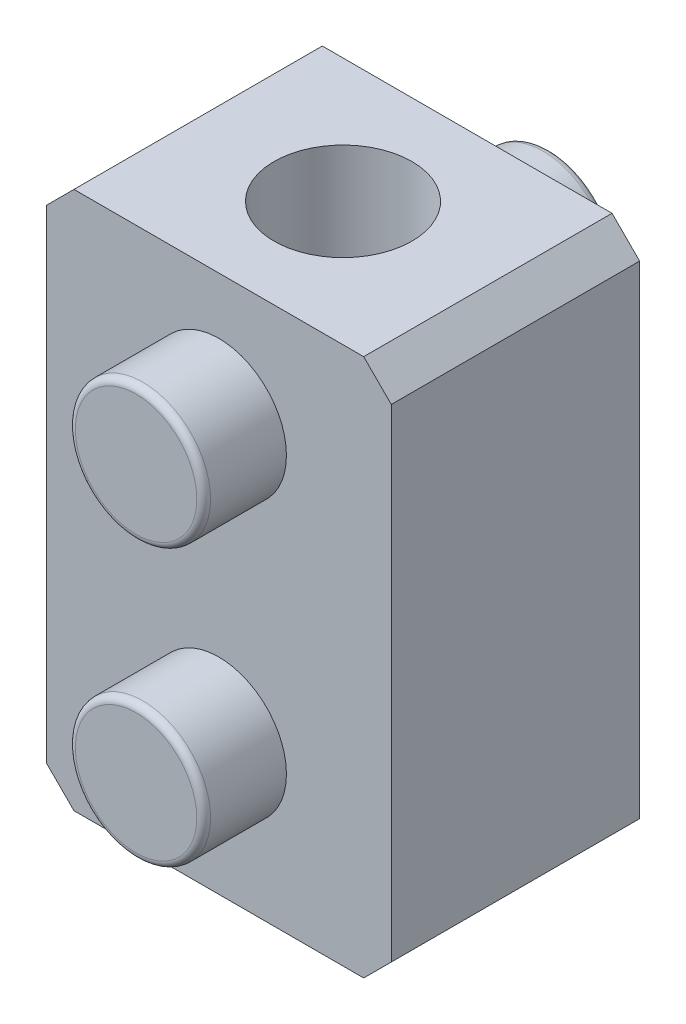
ISO-10303-21;
HEADER;
FILE_DESCRIPTION(('STEP AP214'),'2;1');
FILE_NAME('part.step','',(''),(''),'','','');
FILE_SCHEMA(('AUTOMOTIVE_DESIGN { 1 0 10303 214 1 1 1 1 }'));
ENDSEC;
DATA;
#1=APPLICATION_CONTEXT('core data for automotive mechanical design processes');
#2=APPLICATION_PROTOCOL_DEFINITION('international standard','automotive_design',2000,#1);
#3=PRODUCT_CONTEXT('',#1,'mechanical');
#4=PRODUCT('Part','Part','',(#3));
#5=PRODUCT_RELATED_PRODUCT_CATEGORY('part','',(#4));
#6=PRODUCT_DEFINITION_FORMATION('','',#4);
#7=PRODUCT_DEFINITION_CONTEXT('part definition',#1,'design');
#8=PRODUCT_DEFINITION('design','',#6,#7);
#9=PRODUCT_DEFINITION_SHAPE('','',#8);
#10=(LENGTH_UNIT() NAMED_UNIT(*) SI_UNIT(.MILLI.,.METRE.));
#11=(NAMED_UNIT(*) PLANE_ANGLE_UNIT() SI_UNIT($,.RADIAN.));
#12=(NAMED_UNIT(*) SI_UNIT($,.STERADIAN.) SOLID_ANGLE_UNIT());
#13=UNCERTAINTY_MEASURE_WITH_UNIT(LENGTH_MEASURE(1.E-05),#10,'distance_accuracy_value','');
#14=(GEOMETRIC_REPRESENTATION_CONTEXT(3) GLOBAL_UNCERTAINTY_ASSIGNED_CONTEXT((#13)) GLOBAL_UNIT_ASSIGNED_CONTEXT((#10,
#11,#12)) REPRESENTATION_CONTEXT('',''));
#15=CARTESIAN_POINT('',(0.,0.,0.));
#16=DIRECTION('',(0.,0.,1.));
#17=DIRECTION('',(1.,0.,0.));
#18=AXIS2_PLACEMENT_3D('',#15,#16,#17);
#19=CARTESIAN_POINT('',(6.25,9.75,9.));
#20=DIRECTION('',(-1.,0.,0.));
#21=DIRECTION('',(0.,-1.,0.));
#22=AXIS2_PLACEMENT_3D('',#19,#20,#21);
#23=PLANE('',#22);
#24=DIRECTION('',(0.,1.,0.));
#25=VECTOR('',#24,1.);
#26=CARTESIAN_POINT('',(6.25,9.75,0.));
#27=LINE('',#26,#25);
#28=CARTESIAN_POINT('',(6.25,-8.75,0.));
#29=VERTEX_POINT('',#28);
#30=CARTESIAN_POINT('',(6.25,8.75,0.));
#31=VERTEX_POINT('',#30);
#32=EDGE_CURVE('E131',#29,#31,#27,.T.);
#33=ORIENTED_EDGE('',*,*,#32,.T.);
#34=DIRECTION('',(0.,0.,1.));
#35=VECTOR('',#34,1.);
#36=CARTESIAN_POINT('',(6.25,8.75,9.));
#37=LINE('',#36,#35);
#38=CARTESIAN_POINT('',(6.25,8.75,9.));
#39=VERTEX_POINT('',#38);
#40=EDGE_CURVE('E183',#31,#39,#37,.T.);
#41=ORIENTED_EDGE('',*,*,#40,.T.);
#42=DIRECTION('',(0.,1.,0.));
#43=VECTOR('',#42,1.);
#44=CARTESIAN_POINT('',(6.25,9.75,9.));
#45=LINE('',#44,#43);
#46=CARTESIAN_POINT('',(6.25,-8.75,9.));
#47=VERTEX_POINT('',#46);
#48=EDGE_CURVE('E129',#47,#39,#45,.T.);
#49=ORIENTED_EDGE('',*,*,#48,.F.);
#50=DIRECTION('',(0.,0.,-1.));
#51=VECTOR('',#50,1.);
#52=CARTESIAN_POINT('',(6.25,-8.75,9.));
#53=LINE('',#52,#51);
#54=EDGE_CURVE('E180',#47,#29,#53,.T.);
#55=ORIENTED_EDGE('',*,*,#54,.T.);
#56=EDGE_LOOP('',(#33,#41,#49,#55));
#57=FACE_BOUND('',#56,.T.);
#58=ADVANCED_FACE('F34',(#57),#23,.F.);
#59=CARTESIAN_POINT('',(-6.25,9.75,9.));
#60=DIRECTION('',(0.,-1.,0.));
#61=DIRECTION('',(0.,0.,-1.));
#62=AXIS2_PLACEMENT_3D('',#59,#60,#61);
#63=PLANE('',#62);
#64=CARTESIAN_POINT('',(0.,9.75,4.5));
#65=DIRECTION('',(0.,-1.,0.));
#66=DIRECTION('',(0.,0.,-1.));
#67=AXIS2_PLACEMENT_3D('',#64,#65,#66);
#68=CIRCLE('',#67,2.49999999999999);
#69=CARTESIAN_POINT('',(0.,9.75,2.00000000000001));
#70=VERTEX_POINT('',#69);
#71=EDGE_CURVE('E213',#70,#70,#68,.T.);
#72=ORIENTED_EDGE('',*,*,#71,.T.);
#73=EDGE_LOOP('',(#72));
#74=FACE_BOUND('',#73,.T.);
#75=DIRECTION('',(-1.,0.,0.));
#76=VECTOR('',#75,1.);
#77=CARTESIAN_POINT('',(-6.25,9.75,0.));
#78=LINE('',#77,#76);
#79=CARTESIAN_POINT('',(5.25,9.75,0.));
#80=VERTEX_POINT('',#79);
#81=CARTESIAN_POINT('',(-5.25,9.75,0.));
#82=VERTEX_POINT('',#81);
#83=EDGE_CURVE('E127',#80,#82,#78,.T.);
#84=ORIENTED_EDGE('',*,*,#83,.T.);
#85=DIRECTION('',(0.,0.,1.));
#86=VECTOR('',#85,1.);
#87=CARTESIAN_POINT('',(-5.25,9.75,9.));
#88=LINE('',#87,#86);
#89=CARTESIAN_POINT('',(-5.25,9.75,9.));
#90=VERTEX_POINT('',#89);
#91=EDGE_CURVE('E105',#82,#90,#88,.T.);
#92=ORIENTED_EDGE('',*,*,#91,.T.);
#93=DIRECTION('',(-1.,0.,0.));
#94=VECTOR('',#93,1.);
#95=CARTESIAN_POINT('',(-6.25,9.75,9.));
#96=LINE('',#95,#94);
#97=CARTESIAN_POINT('',(5.25,9.75,9.));
#98=VERTEX_POINT('',#97);
#99=EDGE_CURVE('E197',#98,#90,#96,.T.);
#100=ORIENTED_EDGE('',*,*,#99,.F.);
#101=DIRECTION('',(0.,0.,-1.));
#102=VECTOR('',#101,1.);
#103=CARTESIAN_POINT('',(5.25,9.75,9.));
#104=LINE('',#103,#102);
#105=EDGE_CURVE('E110',#98,#80,#104,.T.);
#106=ORIENTED_EDGE('',*,*,#105,.T.);
#107=EDGE_LOOP('',(#84,#92,#100,#106));
#108=FACE_BOUND('',#107,.T.);
#109=ADVANCED_FACE('F202',(#74,#108),#63,.F.);
#110=CARTESIAN_POINT('',(-6.25,9.75,9.));
#111=DIRECTION('',(1.,0.,0.));
#112=DIRECTION('',(0.,1.,0.));
#113=AXIS2_PLACEMENT_3D('',#110,#111,#112);
#114=PLANE('',#113);
#115=DIRECTION('',(0.,-1.,0.));
#116=VECTOR('',#115,1.);
#117=CARTESIAN_POINT('',(-6.25,9.75,9.));
#118=LINE('',#117,#116);
#119=CARTESIAN_POINT('',(-6.25,8.75,9.));
#120=VERTEX_POINT('',#119);
#121=CARTESIAN_POINT('',(-6.25,-8.75,9.));
#122=VERTEX_POINT('',#121);
#123=EDGE_CURVE('E119',#120,#122,#118,.T.);
#124=ORIENTED_EDGE('',*,*,#123,.F.);
#125=DIRECTION('',(0.,0.,-1.));
#126=VECTOR('',#125,1.);
#127=CARTESIAN_POINT('',(-6.25,8.75,9.));
#128=LINE('',#127,#126);
#129=CARTESIAN_POINT('',(-6.25,8.75,0.));
#130=VERTEX_POINT('',#129);
#131=EDGE_CURVE('E104',#120,#130,#128,.T.);
#132=ORIENTED_EDGE('',*,*,#131,.T.);
#133=DIRECTION('',(0.,-1.,0.));
#134=VECTOR('',#133,1.);
#135=CARTESIAN_POINT('',(-6.25,9.75,0.));
#136=LINE('',#135,#134);
#137=CARTESIAN_POINT('',(-6.25,-8.75,0.));
#138=VERTEX_POINT('',#137);
#139=EDGE_CURVE('E117',#130,#138,#136,.T.);
#140=ORIENTED_EDGE('',*,*,#139,.T.);
#141=DIRECTION('',(0.,0.,1.));
#142=VECTOR('',#141,1.);
#143=CARTESIAN_POINT('',(-6.25,-8.75,9.));
#144=LINE('',#143,#142);
#145=EDGE_CURVE('E121',#138,#122,#144,.T.);
#146=ORIENTED_EDGE('',*,*,#145,.T.);
#147=EDGE_LOOP('',(#124,#132,#140,#146));
#148=FACE_BOUND('',#147,.T.);
#149=ADVANCED_FACE('F116',(#148),#114,.F.);
#150=CARTESIAN_POINT('',(-6.25,-9.75,9.));
#151=DIRECTION('',(0.,1.,0.));
#152=DIRECTION('',(0.,0.,1.));
#153=AXIS2_PLACEMENT_3D('',#150,#151,#152);
#154=PLANE('',#153);
#155=CARTESIAN_POINT('',(0.,-9.75,4.5));
#156=DIRECTION('',(0.,-1.,0.));
#157=DIRECTION('',(0.,0.,-1.));
#158=AXIS2_PLACEMENT_3D('',#155,#156,#157);
#159=CIRCLE('',#158,2.49999999999999);
#160=CARTESIAN_POINT('',(0.,-9.75,2.00000000000001));
#161=VERTEX_POINT('',#160);
#162=EDGE_CURVE('E216',#161,#161,#159,.T.);
#163=ORIENTED_EDGE('',*,*,#162,.F.);
#164=EDGE_LOOP('',(#163));
#165=FACE_BOUND('',#164,.T.);
#166=DIRECTION('',(1.,0.,0.));
#167=VECTOR('',#166,1.);
#168=CARTESIAN_POINT('',(-6.25,-9.75,9.));
#169=LINE('',#168,#167);
#170=CARTESIAN_POINT('',(-5.25,-9.75,9.));
#171=VERTEX_POINT('',#170);
#172=CARTESIAN_POINT('',(5.25,-9.75,9.));
#173=VERTEX_POINT('',#172);
#174=EDGE_CURVE('E139',#171,#173,#169,.T.);
#175=ORIENTED_EDGE('',*,*,#174,.F.);
#176=DIRECTION('',(0.,0.,-1.));
#177=VECTOR('',#176,1.);
#178=CARTESIAN_POINT('',(-5.25,-9.75,9.));
#179=LINE('',#178,#177);
#180=CARTESIAN_POINT('',(-5.25,-9.75,0.));
#181=VERTEX_POINT('',#180);
#182=EDGE_CURVE('E11',#171,#181,#179,.T.);
#183=ORIENTED_EDGE('',*,*,#182,.T.);
#184=DIRECTION('',(1.,0.,0.));
#185=VECTOR('',#184,1.);
#186=CARTESIAN_POINT('',(-6.25,-9.75,0.));
#187=LINE('',#186,#185);
#188=CARTESIAN_POINT('',(5.25,-9.75,0.));
#189=VERTEX_POINT('',#188);
#190=EDGE_CURVE('E126',#181,#189,#187,.T.);
#191=ORIENTED_EDGE('',*,*,#190,.T.);
#192=DIRECTION('',(0.,0.,1.));
#193=VECTOR('',#192,1.);
#194=CARTESIAN_POINT('',(5.25,-9.75,9.));
#195=LINE('',#194,#193);
#196=EDGE_CURVE('E42',#189,#173,#195,.T.);
#197=ORIENTED_EDGE('',*,*,#196,.T.);
#198=EDGE_LOOP('',(#175,#183,#191,#197));
#199=FACE_BOUND('',#198,.T.);
#200=ADVANCED_FACE('F222',(#165,#199),#154,.F.);
#201=CARTESIAN_POINT('',(0.,0.,9.));
#202=DIRECTION('',(0.,0.,1.));
#203=DIRECTION('',(1.,0.,0.));
#204=AXIS2_PLACEMENT_3D('',#201,#202,#203);
#205=PLANE('',#204);
#206=CARTESIAN_POINT('',(0.,5.25,9.));
#207=DIRECTION('',(0.,0.,1.));
#208=DIRECTION('',(1.,0.,0.));
#209=AXIS2_PLACEMENT_3D('',#206,#207,#208);
#210=CIRCLE('',#209,2.45);
#211=CARTESIAN_POINT('',(2.45,5.25,9.));
#212=VERTEX_POINT('',#211);
#213=EDGE_CURVE('E205',#212,#212,#210,.T.);
#214=ORIENTED_EDGE('',*,*,#213,.F.);
#215=EDGE_LOOP('',(#214));
#216=FACE_BOUND('',#215,.T.);
#217=CARTESIAN_POINT('',(0.,-4.75,9.));
#218=DIRECTION('',(0.,0.,1.));
#219=DIRECTION('',(1.,0.,0.));
#220=AXIS2_PLACEMENT_3D('',#217,#218,#219);
#221=CIRCLE('',#220,2.45);
#222=CARTESIAN_POINT('',(2.45,-4.75,9.));
#223=VERTEX_POINT('',#222);
#224=EDGE_CURVE('E203',#223,#223,#221,.T.);
#225=ORIENTED_EDGE('',*,*,#224,.F.);
#226=EDGE_LOOP('',(#225));
#227=FACE_BOUND('',#226,.T.);
#228=ORIENTED_EDGE('',*,*,#99,.T.);
#229=DIRECTION('',(0.707106781186549,0.707106781186546,0.));
#230=VECTOR('',#229,1.);
#231=CARTESIAN_POINT('',(-7.49999999999999,7.50000000000002,9.));
#232=LINE('',#231,#230);
#233=EDGE_CURVE('E178',#90,#120,#232,.F.);
#234=ORIENTED_EDGE('',*,*,#233,.T.);
#235=ORIENTED_EDGE('',*,*,#123,.T.);
#236=DIRECTION('',(-0.707106781186547,0.707106781186548,0.));
#237=VECTOR('',#236,1.);
#238=CARTESIAN_POINT('',(-7.5,-7.49999999999999,9.));
#239=LINE('',#238,#237);
#240=EDGE_CURVE('E55',#122,#171,#239,.F.);
#241=ORIENTED_EDGE('',*,*,#240,.T.);
#242=ORIENTED_EDGE('',*,*,#174,.T.);
#243=DIRECTION('',(-0.707106781186548,-0.707106781186547,0.));
#244=VECTOR('',#243,1.);
#245=CARTESIAN_POINT('',(7.49999999999999,-7.50000000000001,9.));
#246=LINE('',#245,#244);
#247=EDGE_CURVE('E173',#173,#47,#246,.F.);
#248=ORIENTED_EDGE('',*,*,#247,.T.);
#249=ORIENTED_EDGE('',*,*,#48,.T.);
#250=DIRECTION('',(0.707106781186546,-0.707106781186549,0.));
#251=VECTOR('',#250,1.);
#252=CARTESIAN_POINT('',(7.50000000000001,7.49999999999998,9.));
#253=LINE('',#252,#251);
#254=EDGE_CURVE('E176',#39,#98,#253,.F.);
#255=ORIENTED_EDGE('',*,*,#254,.T.);
#256=EDGE_LOOP('',(#228,#234,#235,#241,#242,#248,#249,#255));
#257=FACE_BOUND('',#256,.T.);
#258=ADVANCED_FACE('F194',(#216,#227,#257),#205,.T.);
#259=CARTESIAN_POINT('',(0.,0.,0.));
#260=DIRECTION('',(0.,0.,1.));
#261=DIRECTION('',(1.,0.,0.));
#262=AXIS2_PLACEMENT_3D('',#259,#260,#261);
#263=PLANE('',#262);
#264=CARTESIAN_POINT('',(0.,5.25,0.));
#265=DIRECTION('',(0.,0.,1.));
#266=DIRECTION('',(1.,0.,0.));
#267=AXIS2_PLACEMENT_3D('',#264,#265,#266);
#268=CIRCLE('',#267,2.45);
#269=CARTESIAN_POINT('',(2.45,5.25,0.));
#270=VERTEX_POINT('',#269);
#271=EDGE_CURVE('E138',#270,#270,#268,.F.);
#272=ORIENTED_EDGE('',*,*,#271,.F.);
#273=EDGE_LOOP('',(#272));
#274=FACE_BOUND('',#273,.T.);
#275=CARTESIAN_POINT('',(0.,-4.75,0.));
#276=DIRECTION('',(0.,0.,1.));
#277=DIRECTION('',(1.,0.,0.));
#278=AXIS2_PLACEMENT_3D('',#275,#276,#277);
#279=CIRCLE('',#278,2.45);
#280=CARTESIAN_POINT('',(2.45,-4.75,0.));
#281=VERTEX_POINT('',#280);
#282=EDGE_CURVE('E135',#281,#281,#279,.F.);
#283=ORIENTED_EDGE('',*,*,#282,.F.);
#284=EDGE_LOOP('',(#283));
#285=FACE_BOUND('',#284,.T.);
#286=ORIENTED_EDGE('',*,*,#139,.F.);
#287=DIRECTION('',(-0.707106781186549,-0.707106781186546,0.));
#288=VECTOR('',#287,1.);
#289=CARTESIAN_POINT('',(-6.25,8.75,0.));
#290=LINE('',#289,#288);
#291=EDGE_CURVE('E100',#130,#82,#290,.F.);
#292=ORIENTED_EDGE('',*,*,#291,.T.);
#293=ORIENTED_EDGE('',*,*,#83,.F.);
#294=DIRECTION('',(-0.707106781186546,0.707106781186549,0.));
#295=VECTOR('',#294,1.);
#296=CARTESIAN_POINT('',(5.25,9.75,0.));
#297=LINE('',#296,#295);
#298=EDGE_CURVE('E111',#80,#31,#297,.F.);
#299=ORIENTED_EDGE('',*,*,#298,.T.);
#300=ORIENTED_EDGE('',*,*,#32,.F.);
#301=DIRECTION('',(0.707106781186548,0.707106781186547,0.));
#302=VECTOR('',#301,1.);
#303=CARTESIAN_POINT('',(6.25,-8.75,0.));
#304=LINE('',#303,#302);
#305=EDGE_CURVE('E120',#29,#189,#304,.F.);
#306=ORIENTED_EDGE('',*,*,#305,.T.);
#307=ORIENTED_EDGE('',*,*,#190,.F.);
#308=DIRECTION('',(0.707106781186547,-0.707106781186548,0.));
#309=VECTOR('',#308,1.);
#310=CARTESIAN_POINT('',(-5.25,-9.75,0.));
#311=LINE('',#310,#309);
#312=EDGE_CURVE('E125',#181,#138,#311,.F.);
#313=ORIENTED_EDGE('',*,*,#312,.T.);
#314=EDGE_LOOP('',(#286,#292,#293,#299,#300,#306,#307,#313));
#315=FACE_BOUND('',#314,.T.);
#316=ADVANCED_FACE('F123',(#274,#285,#315),#263,.F.);
#317=CARTESIAN_POINT('',(0.,-4.75,12.));
#318=DIRECTION('',(0.,0.,-1.));
#319=DIRECTION('',(-1.,0.,0.));
#320=AXIS2_PLACEMENT_3D('',#317,#318,#319);
#321=CYLINDRICAL_SURFACE('',#320,2.45);
#322=CARTESIAN_POINT('',(0.,-4.75,11.75));
#323=DIRECTION('',(0.,0.,1.));
#324=DIRECTION('',(1.,0.,0.));
#325=AXIS2_PLACEMENT_3D('',#322,#323,#324);
#326=CIRCLE('',#325,2.45);
#327=CARTESIAN_POINT('',(2.45,-4.75,11.75));
#328=VERTEX_POINT('',#327);
#329=EDGE_CURVE('E151',#328,#328,#326,.F.);
#330=ORIENTED_EDGE('',*,*,#329,.T.);
#331=EDGE_LOOP('',(#330));
#332=FACE_BOUND('',#331,.T.);
#333=ORIENTED_EDGE('',*,*,#224,.T.);
#334=EDGE_LOOP('',(#333));
#335=FACE_BOUND('',#334,.T.);
#336=ADVANCED_FACE('F297',(#332,#335),#321,.T.);
#337=CARTESIAN_POINT('',(0.,-4.75,12.));
#338=DIRECTION('',(0.,0.,1.));
#339=DIRECTION('',(1.,0.,0.));
#340=AXIS2_PLACEMENT_3D('',#337,#338,#339);
#341=PLANE('',#340);
#342=CARTESIAN_POINT('',(0.,-4.75,12.));
#343=DIRECTION('',(0.,0.,1.));
#344=DIRECTION('',(1.,0.,0.));
#345=AXIS2_PLACEMENT_3D('',#342,#343,#344);
#346=CIRCLE('',#345,2.2);
#347=CARTESIAN_POINT('',(2.2,-4.75,12.));
#348=VERTEX_POINT('',#347);
#349=EDGE_CURVE('E148',#348,#348,#346,.T.);
#350=ORIENTED_EDGE('',*,*,#349,.T.);
#351=EDGE_LOOP('',(#350));
#352=FACE_BOUND('',#351,.T.);
#353=ADVANCED_FACE('F290',(#352),#341,.T.);
#354=CARTESIAN_POINT('',(0.,5.25,12.));
#355=DIRECTION('',(0.,0.,-1.));
#356=DIRECTION('',(-1.,0.,0.));
#357=AXIS2_PLACEMENT_3D('',#354,#355,#356);
#358=CYLINDRICAL_SURFACE('',#357,2.45);
#359=CARTESIAN_POINT('',(0.,5.25,11.75));
#360=DIRECTION('',(0.,0.,1.));
#361=DIRECTION('',(1.,0.,0.));
#362=AXIS2_PLACEMENT_3D('',#359,#360,#361);
#363=CIRCLE('',#362,2.45);
#364=CARTESIAN_POINT('',(2.45,5.25,11.75));
#365=VERTEX_POINT('',#364);
#366=EDGE_CURVE('E145',#365,#365,#363,.F.);
#367=ORIENTED_EDGE('',*,*,#366,.T.);
#368=EDGE_LOOP('',(#367));
#369=FACE_BOUND('',#368,.T.);
#370=ORIENTED_EDGE('',*,*,#213,.T.);
#371=EDGE_LOOP('',(#370));
#372=FACE_BOUND('',#371,.T.);
#373=ADVANCED_FACE('F287',(#369,#372),#358,.T.);
#374=CARTESIAN_POINT('',(0.,5.25,12.));
#375=DIRECTION('',(0.,0.,1.));
#376=DIRECTION('',(1.,0.,0.));
#377=AXIS2_PLACEMENT_3D('',#374,#375,#376);
#378=PLANE('',#377);
#379=CARTESIAN_POINT('',(0.,5.25,12.));
#380=DIRECTION('',(0.,0.,1.));
#381=DIRECTION('',(1.,0.,0.));
#382=AXIS2_PLACEMENT_3D('',#379,#380,#381);
#383=CIRCLE('',#382,2.2);
#384=CARTESIAN_POINT('',(2.2,5.25,12.));
#385=VERTEX_POINT('',#384);
#386=EDGE_CURVE('E142',#385,#385,#383,.T.);
#387=ORIENTED_EDGE('',*,*,#386,.T.);
#388=EDGE_LOOP('',(#387));
#389=FACE_BOUND('',#388,.T.);
#390=ADVANCED_FACE('F285',(#389),#378,.T.);
#391=CARTESIAN_POINT('',(0.,-4.75,-3.));
#392=DIRECTION('',(0.,0.,1.));
#393=DIRECTION('',(1.,0.,0.));
#394=AXIS2_PLACEMENT_3D('',#391,#392,#393);
#395=CYLINDRICAL_SURFACE('',#394,2.45);
#396=CARTESIAN_POINT('',(0.,-4.75,-2.75));
#397=DIRECTION('',(0.,0.,-1.));
#398=DIRECTION('',(-1.,0.,0.));
#399=AXIS2_PLACEMENT_3D('',#396,#397,#398);
#400=CIRCLE('',#399,2.45);
#401=CARTESIAN_POINT('',(-2.45,-4.75,-2.75));
#402=VERTEX_POINT('',#401);
#403=EDGE_CURVE('E157',#402,#402,#400,.F.);
#404=ORIENTED_EDGE('',*,*,#403,.T.);
#405=EDGE_LOOP('',(#404));
#406=FACE_BOUND('',#405,.T.);
#407=ORIENTED_EDGE('',*,*,#282,.T.);
#408=EDGE_LOOP('',(#407));
#409=FACE_BOUND('',#408,.T.);
#410=ADVANCED_FACE('F281',(#406,#409),#395,.T.);
#411=CARTESIAN_POINT('',(0.,0.,-3.));
#412=DIRECTION('',(0.,0.,-1.));
#413=DIRECTION('',(-1.,0.,0.));
#414=AXIS2_PLACEMENT_3D('',#411,#412,#413);
#415=PLANE('',#414);
#416=CARTESIAN_POINT('',(0.,-4.75,-3.));
#417=DIRECTION('',(0.,0.,-1.));
#418=DIRECTION('',(-1.,0.,0.));
#419=AXIS2_PLACEMENT_3D('',#416,#417,#418);
#420=CIRCLE('',#419,2.2);
#421=CARTESIAN_POINT('',(-2.2,-4.75,-3.));
#422=VERTEX_POINT('',#421);
#423=EDGE_CURVE('E154',#422,#422,#420,.T.);
#424=ORIENTED_EDGE('',*,*,#423,.T.);
#425=EDGE_LOOP('',(#424));
#426=FACE_BOUND('',#425,.T.);
#427=ADVANCED_FACE('F277',(#426),#415,.T.);
#428=CARTESIAN_POINT('',(0.,5.25,-3.));
#429=DIRECTION('',(0.,0.,1.));
#430=DIRECTION('',(1.,0.,0.));
#431=AXIS2_PLACEMENT_3D('',#428,#429,#430);
#432=CYLINDRICAL_SURFACE('',#431,2.45);
#433=CARTESIAN_POINT('',(0.,5.25,-2.75));
#434=DIRECTION('',(0.,0.,-1.));
#435=DIRECTION('',(-1.,0.,0.));
#436=AXIS2_PLACEMENT_3D('',#433,#434,#435);
#437=CIRCLE('',#436,2.45);
#438=CARTESIAN_POINT('',(-2.45,5.25,-2.75));
#439=VERTEX_POINT('',#438);
#440=EDGE_CURVE('E163',#439,#439,#437,.F.);
#441=ORIENTED_EDGE('',*,*,#440,.T.);
#442=EDGE_LOOP('',(#441));
#443=FACE_BOUND('',#442,.T.);
#444=ORIENTED_EDGE('',*,*,#271,.T.);
#445=EDGE_LOOP('',(#444));
#446=FACE_BOUND('',#445,.T.);
#447=ADVANCED_FACE('F273',(#443,#446),#432,.T.);
#448=CARTESIAN_POINT('',(0.,0.,-3.));
#449=DIRECTION('',(0.,0.,-1.));
#450=DIRECTION('',(-1.,0.,0.));
#451=AXIS2_PLACEMENT_3D('',#448,#449,#450);
#452=PLANE('',#451);
#453=CARTESIAN_POINT('',(0.,5.25,-3.));
#454=DIRECTION('',(0.,0.,-1.));
#455=DIRECTION('',(-1.,0.,0.));
#456=AXIS2_PLACEMENT_3D('',#453,#454,#455);
#457=CIRCLE('',#456,2.2);
#458=CARTESIAN_POINT('',(-2.2,5.25,-3.));
#459=VERTEX_POINT('',#458);
#460=EDGE_CURVE('E160',#459,#459,#457,.T.);
#461=ORIENTED_EDGE('',*,*,#460,.T.);
#462=EDGE_LOOP('',(#461));
#463=FACE_BOUND('',#462,.T.);
#464=ADVANCED_FACE('F248',(#463),#452,.T.);
#465=CARTESIAN_POINT('',(0.,5.25,11.75));
#466=DIRECTION('',(0.,0.,1.));
#467=DIRECTION('',(1.,0.,0.));
#468=AXIS2_PLACEMENT_3D('',#465,#466,#467);
#469=TOROIDAL_SURFACE('',#468,2.2,0.25);
#470=ORIENTED_EDGE('',*,*,#366,.F.);
#471=EDGE_LOOP('',(#470));
#472=FACE_BOUND('',#471,.T.);
#473=ORIENTED_EDGE('',*,*,#386,.F.);
#474=EDGE_LOOP('',(#473));
#475=FACE_BOUND('',#474,.T.);
#476=ADVANCED_FACE('F244',(#472,#475),#469,.T.);
#477=CARTESIAN_POINT('',(0.,-4.75,11.75));
#478=DIRECTION('',(0.,0.,1.));
#479=DIRECTION('',(1.,0.,0.));
#480=AXIS2_PLACEMENT_3D('',#477,#478,#479);
#481=TOROIDAL_SURFACE('',#480,2.2,0.25);
#482=ORIENTED_EDGE('',*,*,#329,.F.);
#483=EDGE_LOOP('',(#482));
#484=FACE_BOUND('',#483,.T.);
#485=ORIENTED_EDGE('',*,*,#349,.F.);
#486=EDGE_LOOP('',(#485));
#487=FACE_BOUND('',#486,.T.);
#488=ADVANCED_FACE('F247',(#484,#487),#481,.T.);
#489=CARTESIAN_POINT('',(0.,-4.75,-2.75));
#490=DIRECTION('',(0.,0.,-1.));
#491=DIRECTION('',(-1.,0.,0.));
#492=AXIS2_PLACEMENT_3D('',#489,#490,#491);
#493=TOROIDAL_SURFACE('',#492,2.2,0.25);
#494=ORIENTED_EDGE('',*,*,#403,.F.);
#495=EDGE_LOOP('',(#494));
#496=FACE_BOUND('',#495,.T.);
#497=ORIENTED_EDGE('',*,*,#423,.F.);
#498=EDGE_LOOP('',(#497));
#499=FACE_BOUND('',#498,.T.);
#500=ADVANCED_FACE('F252',(#496,#499),#493,.T.);
#501=CARTESIAN_POINT('',(0.,5.25,-2.75));
#502=DIRECTION('',(0.,0.,-1.));
#503=DIRECTION('',(-1.,0.,0.));
#504=AXIS2_PLACEMENT_3D('',#501,#502,#503);
#505=TOROIDAL_SURFACE('',#504,2.2,0.25);
#506=ORIENTED_EDGE('',*,*,#440,.F.);
#507=EDGE_LOOP('',(#506));
#508=FACE_BOUND('',#507,.T.);
#509=ORIENTED_EDGE('',*,*,#460,.F.);
#510=EDGE_LOOP('',(#509));
#511=FACE_BOUND('',#510,.T.);
#512=ADVANCED_FACE('F256',(#508,#511),#505,.T.);
#513=CARTESIAN_POINT('',(0.,-9.75,4.5));
#514=DIRECTION('',(0.,-1.,0.));
#515=DIRECTION('',(0.,0.,-1.));
#516=AXIS2_PLACEMENT_3D('',#513,#514,#515);
#517=CYLINDRICAL_SURFACE('',#516,2.49999999999999);
#518=ORIENTED_EDGE('',*,*,#71,.F.);
#519=EDGE_LOOP('',(#518));
#520=FACE_BOUND('',#519,.T.);
#521=ORIENTED_EDGE('',*,*,#162,.T.);
#522=EDGE_LOOP('',(#521));
#523=FACE_BOUND('',#522,.T.);
#524=ADVANCED_FACE('F220',(#520,#523),#517,.F.);
#525=CARTESIAN_POINT('',(-6.25,8.75,9.));
#526=DIRECTION('',(0.707106781186546,-0.707106781186549,0.));
#527=DIRECTION('',(0.,0.,-1.));
#528=AXIS2_PLACEMENT_3D('',#525,#526,#527);
#529=PLANE('',#528);
#530=ORIENTED_EDGE('',*,*,#233,.F.);
#531=ORIENTED_EDGE('',*,*,#91,.F.);
#532=ORIENTED_EDGE('',*,*,#291,.F.);
#533=ORIENTED_EDGE('',*,*,#131,.F.);
#534=EDGE_LOOP('',(#530,#531,#532,#533));
#535=FACE_BOUND('',#534,.T.);
#536=ADVANCED_FACE('F103',(#535),#529,.F.);
#537=CARTESIAN_POINT('',(5.25,9.75,9.));
#538=DIRECTION('',(-0.707106781186549,-0.707106781186546,0.));
#539=DIRECTION('',(0.,0.,-1.));
#540=AXIS2_PLACEMENT_3D('',#537,#538,#539);
#541=PLANE('',#540);
#542=ORIENTED_EDGE('',*,*,#254,.F.);
#543=ORIENTED_EDGE('',*,*,#40,.F.);
#544=ORIENTED_EDGE('',*,*,#298,.F.);
#545=ORIENTED_EDGE('',*,*,#105,.F.);
#546=EDGE_LOOP('',(#542,#543,#544,#545));
#547=FACE_BOUND('',#546,.T.);
#548=ADVANCED_FACE('F200',(#547),#541,.F.);
#549=CARTESIAN_POINT('',(-5.25,-9.75,9.));
#550=DIRECTION('',(0.707106781186548,0.707106781186547,0.));
#551=DIRECTION('',(0.,0.,-1.));
#552=AXIS2_PLACEMENT_3D('',#549,#550,#551);
#553=PLANE('',#552);
#554=ORIENTED_EDGE('',*,*,#240,.F.);
#555=ORIENTED_EDGE('',*,*,#145,.F.);
#556=ORIENTED_EDGE('',*,*,#312,.F.);
#557=ORIENTED_EDGE('',*,*,#182,.F.);
#558=EDGE_LOOP('',(#554,#555,#556,#557));
#559=FACE_BOUND('',#558,.T.);
#560=ADVANCED_FACE('F227',(#559),#553,.F.);
#561=CARTESIAN_POINT('',(6.25,-8.75,9.));
#562=DIRECTION('',(-0.707106781186547,0.707106781186548,0.));
#563=DIRECTION('',(0.,0.,-1.));
#564=AXIS2_PLACEMENT_3D('',#561,#562,#563);
#565=PLANE('',#564);
#566=ORIENTED_EDGE('',*,*,#247,.F.);
#567=ORIENTED_EDGE('',*,*,#196,.F.);
#568=ORIENTED_EDGE('',*,*,#305,.F.);
#569=ORIENTED_EDGE('',*,*,#54,.F.);
#570=EDGE_LOOP('',(#566,#567,#568,#569));
#571=FACE_BOUND('',#570,.T.);
#572=ADVANCED_FACE('F36',(#571),#565,.F.);
#573=CLOSED_SHELL('',(#58,#109,#149,#200,#258,#316,#336,#353,#373,#390,#410,#427,#447,#464,#476,
#488,#500,#512,#524,#536,#548,#560,#572));
#574=MANIFOLD_SOLID_BREP('B2',#573);
#575=ADVANCED_BREP_SHAPE_REPRESENTATION('',(#18,#574),#14);
#576=SHAPE_DEFINITION_REPRESENTATION(#9,#575);
ENDSEC;
END-ISO-10303-21;
